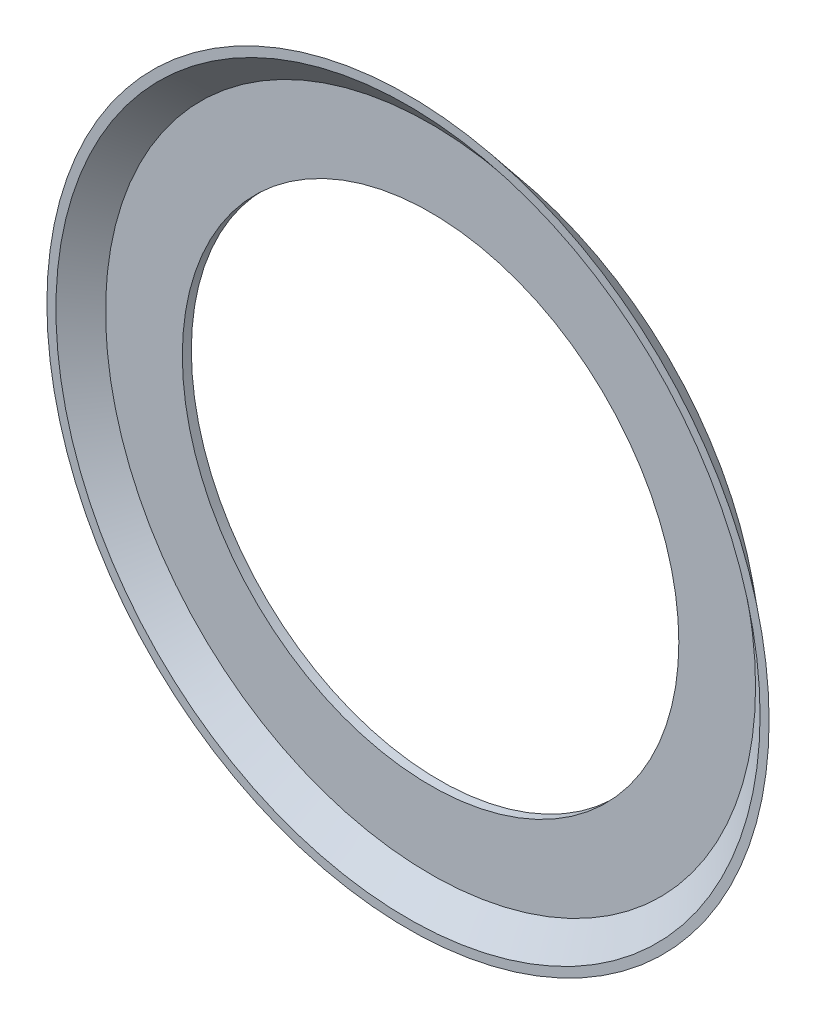
ISO-10303-21;
HEADER;
FILE_DESCRIPTION(('STEP AP214'),'2;1');
FILE_NAME('part.step','',(''),(''),'','','');
FILE_SCHEMA(('AUTOMOTIVE_DESIGN { 1 0 10303 214 1 1 1 1 }'));
ENDSEC;
DATA;
#1=APPLICATION_CONTEXT('core data for automotive mechanical design processes');
#2=APPLICATION_PROTOCOL_DEFINITION('international standard','automotive_design',2000,#1);
#3=PRODUCT_CONTEXT('',#1,'mechanical');
#4=PRODUCT('Part','Part','',(#3));
#5=PRODUCT_RELATED_PRODUCT_CATEGORY('part','',(#4));
#6=PRODUCT_DEFINITION_FORMATION('','',#4);
#7=PRODUCT_DEFINITION_CONTEXT('part definition',#1,'design');
#8=PRODUCT_DEFINITION('design','',#6,#7);
#9=PRODUCT_DEFINITION_SHAPE('','',#8);
#10=(LENGTH_UNIT() NAMED_UNIT(*) SI_UNIT(.MILLI.,.METRE.));
#11=(NAMED_UNIT(*) PLANE_ANGLE_UNIT() SI_UNIT($,.RADIAN.));
#12=(NAMED_UNIT(*) SI_UNIT($,.STERADIAN.) SOLID_ANGLE_UNIT());
#13=UNCERTAINTY_MEASURE_WITH_UNIT(LENGTH_MEASURE(1.E-05),#10,'distance_accuracy_value','');
#14=(GEOMETRIC_REPRESENTATION_CONTEXT(3) GLOBAL_UNCERTAINTY_ASSIGNED_CONTEXT((#13)) GLOBAL_UNIT_ASSIGNED_CONTEXT((#10,
#11,#12)) REPRESENTATION_CONTEXT('',''));
#15=CARTESIAN_POINT('',(0.,0.,0.));
#16=DIRECTION('',(0.,0.,1.));
#17=DIRECTION('',(1.,0.,0.));
#18=AXIS2_PLACEMENT_3D('',#15,#16,#17);
#19=CARTESIAN_POINT('',(0.,0.,19.5629698978146));
#20=DIRECTION('',(0.,0.,1.));
#21=DIRECTION('',(1.,0.,0.));
#22=AXIS2_PLACEMENT_3D('',#19,#20,#21);
#23=CYLINDRICAL_SURFACE('',#22,55.);
#24=CARTESIAN_POINT('',(0.,0.,-1.99999999999999));
#25=DIRECTION('',(0.,0.,1.));
#26=DIRECTION('',(1.,0.,0.));
#27=AXIS2_PLACEMENT_3D('',#24,#25,#26);
#28=CIRCLE('',#27,55.);
#29=CARTESIAN_POINT('',(55.,0.,-1.99999999999999));
#30=VERTEX_POINT('',#29);
#31=EDGE_CURVE('E59',#30,#30,#28,.T.);
#32=ORIENTED_EDGE('',*,*,#31,.F.);
#33=EDGE_LOOP('',(#32));
#34=FACE_BOUND('',#33,.T.);
#35=CARTESIAN_POINT('',(0.,0.,0.));
#36=DIRECTION('',(0.,0.,1.));
#37=DIRECTION('',(1.,0.,0.));
#38=AXIS2_PLACEMENT_3D('',#35,#36,#37);
#39=CIRCLE('',#38,55.);
#40=CARTESIAN_POINT('',(55.,0.,0.));
#41=VERTEX_POINT('',#40);
#42=EDGE_CURVE('E10',#41,#41,#39,.T.);
#43=ORIENTED_EDGE('',*,*,#42,.T.);
#44=EDGE_LOOP('',(#43));
#45=FACE_BOUND('',#44,.T.);
#46=ADVANCED_FACE('F31',(#34,#45),#23,.F.);
#47=CARTESIAN_POINT('',(0.,55.,0.));
#48=DIRECTION('',(0.,0.,-1.));
#49=DIRECTION('',(-1.,0.,0.));
#50=AXIS2_PLACEMENT_3D('',#47,#48,#49);
#51=PLANE('',#50);
#52=ORIENTED_EDGE('',*,*,#42,.F.);
#53=EDGE_LOOP('',(#52));
#54=FACE_BOUND('',#53,.T.);
#55=CARTESIAN_POINT('',(0.,0.,0.));
#56=DIRECTION('',(0.,0.,1.));
#57=DIRECTION('',(1.,0.,0.));
#58=AXIS2_PLACEMENT_3D('',#55,#56,#57);
#59=CIRCLE('',#58,72.);
#60=CARTESIAN_POINT('',(72.,0.,0.));
#61=VERTEX_POINT('',#60);
#62=EDGE_CURVE('E37',#61,#61,#59,.T.);
#63=ORIENTED_EDGE('',*,*,#62,.T.);
#64=EDGE_LOOP('',(#63));
#65=FACE_BOUND('',#64,.T.);
#66=ADVANCED_FACE('F66',(#54,#65),#51,.F.);
#67=CARTESIAN_POINT('',(0.,0.,5.00000000000001));
#68=DIRECTION('',(0.,0.,1.));
#69=DIRECTION('',(1.,0.,0.));
#70=AXIS2_PLACEMENT_3D('',#67,#68,#69);
#71=CONICAL_SURFACE('',#70,78.,0.876058050598193);
#72=ORIENTED_EDGE('',*,*,#62,.F.);
#73=EDGE_LOOP('',(#72));
#74=FACE_BOUND('',#73,.T.);
#75=CARTESIAN_POINT('',(0.,0.,5.00000000000001));
#76=DIRECTION('',(0.,0.,1.));
#77=DIRECTION('',(1.,0.,0.));
#78=AXIS2_PLACEMENT_3D('',#75,#76,#77);
#79=CIRCLE('',#78,78.);
#80=CARTESIAN_POINT('',(78.,0.,5.00000000000001));
#81=VERTEX_POINT('',#80);
#82=EDGE_CURVE('E41',#81,#81,#79,.T.);
#83=ORIENTED_EDGE('',*,*,#82,.T.);
#84=EDGE_LOOP('',(#83));
#85=FACE_BOUND('',#84,.T.);
#86=ADVANCED_FACE('F70',(#74,#85),#71,.F.);
#87=CARTESIAN_POINT('',(0.,78.,5.00000000000001));
#88=DIRECTION('',(0.,0.,-1.));
#89=DIRECTION('',(-1.,0.,0.));
#90=AXIS2_PLACEMENT_3D('',#87,#88,#89);
#91=PLANE('',#90);
#92=ORIENTED_EDGE('',*,*,#82,.F.);
#93=EDGE_LOOP('',(#92));
#94=FACE_BOUND('',#93,.T.);
#95=CARTESIAN_POINT('',(0.,0.,5.00000000000001));
#96=DIRECTION('',(0.,0.,1.));
#97=DIRECTION('',(1.,0.,0.));
#98=AXIS2_PLACEMENT_3D('',#95,#96,#97);
#99=CIRCLE('',#98,80.);
#100=CARTESIAN_POINT('',(80.,0.,5.00000000000001));
#101=VERTEX_POINT('',#100);
#102=EDGE_CURVE('E45',#101,#101,#99,.T.);
#103=ORIENTED_EDGE('',*,*,#102,.T.);
#104=EDGE_LOOP('',(#103));
#105=FACE_BOUND('',#104,.T.);
#106=ADVANCED_FACE('F75',(#94,#105),#91,.F.);
#107=CARTESIAN_POINT('',(0.,0.,-4.99999999999999));
#108=DIRECTION('',(0.,0.,1.));
#109=DIRECTION('',(1.,0.,0.));
#110=AXIS2_PLACEMENT_3D('',#107,#108,#109);
#111=CONICAL_SURFACE('',#110,68.,0.876058050598193);
#112=ORIENTED_EDGE('',*,*,#102,.F.);
#113=EDGE_LOOP('',(#112));
#114=FACE_BOUND('',#113,.T.);
#115=CARTESIAN_POINT('',(0.,0.,-4.99999999999999));
#116=DIRECTION('',(0.,0.,1.));
#117=DIRECTION('',(1.,0.,0.));
#118=AXIS2_PLACEMENT_3D('',#115,#116,#117);
#119=CIRCLE('',#118,68.);
#120=CARTESIAN_POINT('',(68.,0.,-4.99999999999999));
#121=VERTEX_POINT('',#120);
#122=EDGE_CURVE('E50',#121,#121,#119,.T.);
#123=ORIENTED_EDGE('',*,*,#122,.T.);
#124=EDGE_LOOP('',(#123));
#125=FACE_BOUND('',#124,.T.);
#126=ADVANCED_FACE('F81',(#114,#125),#111,.T.);
#127=CARTESIAN_POINT('',(0.,68.,-4.99999999999999));
#128=DIRECTION('',(0.,0.,1.));
#129=DIRECTION('',(1.,0.,0.));
#130=AXIS2_PLACEMENT_3D('',#127,#128,#129);
#131=PLANE('',#130);
#132=ORIENTED_EDGE('',*,*,#122,.F.);
#133=EDGE_LOOP('',(#132));
#134=FACE_BOUND('',#133,.T.);
#135=CARTESIAN_POINT('',(0.,0.,-4.99999999999999));
#136=DIRECTION('',(0.,0.,1.));
#137=DIRECTION('',(1.,0.,0.));
#138=AXIS2_PLACEMENT_3D('',#135,#136,#137);
#139=CIRCLE('',#138,66.);
#140=CARTESIAN_POINT('',(66.,0.,-4.99999999999999));
#141=VERTEX_POINT('',#140);
#142=EDGE_CURVE('E53',#141,#141,#139,.T.);
#143=ORIENTED_EDGE('',*,*,#142,.T.);
#144=EDGE_LOOP('',(#143));
#145=FACE_BOUND('',#144,.T.);
#146=ADVANCED_FACE('F85',(#134,#145),#131,.F.);
#147=CARTESIAN_POINT('',(0.,0.,-1.99999999999999));
#148=DIRECTION('',(0.,0.,1.));
#149=DIRECTION('',(1.,0.,0.));
#150=AXIS2_PLACEMENT_3D('',#147,#148,#149);
#151=CONICAL_SURFACE('',#150,69.6,0.876058050598192);
#152=ORIENTED_EDGE('',*,*,#142,.F.);
#153=EDGE_LOOP('',(#152));
#154=FACE_BOUND('',#153,.T.);
#155=CARTESIAN_POINT('',(0.,0.,-1.99999999999999));
#156=DIRECTION('',(0.,0.,1.));
#157=DIRECTION('',(1.,0.,0.));
#158=AXIS2_PLACEMENT_3D('',#155,#156,#157);
#159=CIRCLE('',#158,69.6);
#160=CARTESIAN_POINT('',(69.6,0.,-1.99999999999999));
#161=VERTEX_POINT('',#160);
#162=EDGE_CURVE('E56',#161,#161,#159,.T.);
#163=ORIENTED_EDGE('',*,*,#162,.T.);
#164=EDGE_LOOP('',(#163));
#165=FACE_BOUND('',#164,.T.);
#166=ADVANCED_FACE('F89',(#154,#165),#151,.F.);
#167=CARTESIAN_POINT('',(0.,55.,-1.99999999999999));
#168=DIRECTION('',(0.,0.,1.));
#169=DIRECTION('',(1.,0.,0.));
#170=AXIS2_PLACEMENT_3D('',#167,#168,#169);
#171=PLANE('',#170);
#172=ORIENTED_EDGE('',*,*,#162,.F.);
#173=EDGE_LOOP('',(#172));
#174=FACE_BOUND('',#173,.T.);
#175=ORIENTED_EDGE('',*,*,#31,.T.);
#176=EDGE_LOOP('',(#175));
#177=FACE_BOUND('',#176,.T.);
#178=ADVANCED_FACE('F63',(#174,#177),#171,.F.);
#179=CLOSED_SHELL('',(#46,#66,#86,#106,#126,#146,#166,#178));
#180=MANIFOLD_SOLID_BREP('B2',#179);
#181=ADVANCED_BREP_SHAPE_REPRESENTATION('',(#18,#180),#14);
#182=SHAPE_DEFINITION_REPRESENTATION(#9,#181);
ENDSEC;
END-ISO-10303-21;
